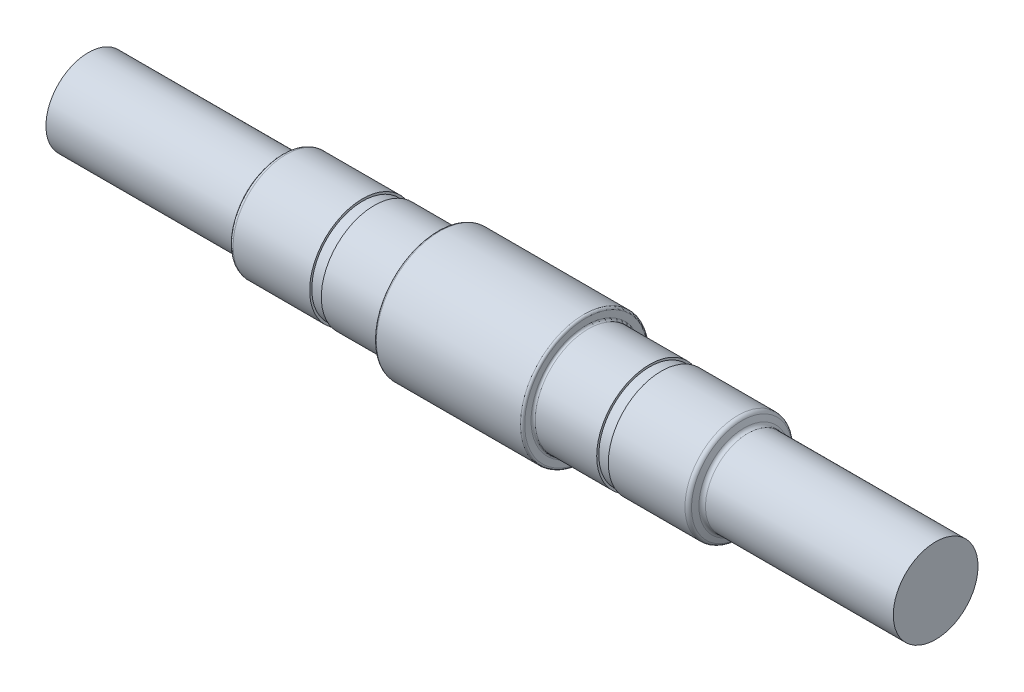
ISO-10303-21;
HEADER;
FILE_DESCRIPTION(('STEP AP214'),'2;1');
FILE_NAME('part.step','',(''),(''),'','','');
FILE_SCHEMA(('AUTOMOTIVE_DESIGN { 1 0 10303 214 1 1 1 1 }'));
ENDSEC;
DATA;
#1=APPLICATION_CONTEXT('core data for automotive mechanical design processes');
#2=APPLICATION_PROTOCOL_DEFINITION('international standard','automotive_design',2000,#1);
#3=PRODUCT_CONTEXT('',#1,'mechanical');
#4=PRODUCT('Part','Part','',(#3));
#5=PRODUCT_RELATED_PRODUCT_CATEGORY('part','',(#4));
#6=PRODUCT_DEFINITION_FORMATION('','',#4);
#7=PRODUCT_DEFINITION_CONTEXT('part definition',#1,'design');
#8=PRODUCT_DEFINITION('design','',#6,#7);
#9=PRODUCT_DEFINITION_SHAPE('','',#8);
#10=(LENGTH_UNIT() NAMED_UNIT(*) SI_UNIT(.MILLI.,.METRE.));
#11=(NAMED_UNIT(*) PLANE_ANGLE_UNIT() SI_UNIT($,.RADIAN.));
#12=(NAMED_UNIT(*) SI_UNIT($,.STERADIAN.) SOLID_ANGLE_UNIT());
#13=UNCERTAINTY_MEASURE_WITH_UNIT(LENGTH_MEASURE(1.E-05),#10,'distance_accuracy_value','');
#14=(GEOMETRIC_REPRESENTATION_CONTEXT(3) GLOBAL_UNCERTAINTY_ASSIGNED_CONTEXT((#13)) GLOBAL_UNIT_ASSIGNED_CONTEXT((#10,
#11,#12)) REPRESENTATION_CONTEXT('',''));
#15=CARTESIAN_POINT('',(0.,0.,0.));
#16=DIRECTION('',(0.,0.,1.));
#17=DIRECTION('',(1.,0.,0.));
#18=AXIS2_PLACEMENT_3D('',#15,#16,#17);
#19=CARTESIAN_POINT('',(-21.6,0.,0.));
#20=DIRECTION('',(1.,0.,0.));
#21=DIRECTION('',(0.,0.,-1.));
#22=AXIS2_PLACEMENT_3D('',#19,#20,#21);
#23=CYLINDRICAL_SURFACE('',#22,5.);
#24=CARTESIAN_POINT('',(-7.2,0.,0.));
#25=DIRECTION('',(-1.,0.,0.));
#26=DIRECTION('',(0.,0.,1.));
#27=AXIS2_PLACEMENT_3D('',#24,#25,#26);
#28=CIRCLE('',#27,5.);
#29=CARTESIAN_POINT('',(-7.2,0.,-5.));
#30=VERTEX_POINT('',#29);
#31=EDGE_CURVE('E65',#30,#30,#28,.T.);
#32=CARTESIAN_POINT('',(-13.,0.,0.));
#33=DIRECTION('',(-1.,0.,0.));
#34=DIRECTION('',(0.,0.,1.));
#35=AXIS2_PLACEMENT_3D('',#32,#33,#34);
#36=CIRCLE('',#35,5.);
#37=CARTESIAN_POINT('',(-13.,0.,-5.));
#38=VERTEX_POINT('',#37);
#39=EDGE_CURVE('E70',#38,#38,#36,.F.);
#40=CARTESIAN_POINT('',(-7.2,0.,-5.));
#41=CARTESIAN_POINT('',(-7.26041666666667,0.,-5.));
#42=CARTESIAN_POINT('',(-7.32083333333333,0.,-5.));
#43=CARTESIAN_POINT('',(-7.44166666666667,0.,-5.));
#44=CARTESIAN_POINT('',(-7.50208333333333,0.,-5.));
#45=CARTESIAN_POINT('',(-7.62291666666667,0.,-5.));
#46=CARTESIAN_POINT('',(-7.68333333333333,0.,-5.));
#47=CARTESIAN_POINT('',(-7.80416666666667,0.,-5.));
#48=CARTESIAN_POINT('',(-7.86458333333333,0.,-5.));
#49=CARTESIAN_POINT('',(-7.98541666666667,0.,-5.));
#50=CARTESIAN_POINT('',(-8.04583333333333,0.,-5.));
#51=CARTESIAN_POINT('',(-8.16666666666667,0.,-5.));
#52=CARTESIAN_POINT('',(-8.22708333333333,0.,-5.));
#53=CARTESIAN_POINT('',(-8.34791666666667,0.,-5.));
#54=CARTESIAN_POINT('',(-8.40833333333333,0.,-5.));
#55=CARTESIAN_POINT('',(-8.52916666666667,0.,-5.));
#56=CARTESIAN_POINT('',(-8.58958333333333,0.,-5.));
#57=CARTESIAN_POINT('',(-8.71041666666667,0.,-5.));
#58=CARTESIAN_POINT('',(-8.77083333333333,0.,-5.));
#59=CARTESIAN_POINT('',(-8.89166666666667,0.,-5.));
#60=CARTESIAN_POINT('',(-8.95208333333333,0.,-5.));
#61=CARTESIAN_POINT('',(-9.07291666666667,0.,-5.));
#62=CARTESIAN_POINT('',(-9.13333333333333,0.,-5.));
#63=CARTESIAN_POINT('',(-9.25416666666667,0.,-5.));
#64=CARTESIAN_POINT('',(-9.31458333333333,0.,-5.));
#65=CARTESIAN_POINT('',(-9.43541666666667,0.,-5.));
#66=CARTESIAN_POINT('',(-9.49583333333333,0.,-5.));
#67=CARTESIAN_POINT('',(-9.61666666666667,0.,-5.));
#68=CARTESIAN_POINT('',(-9.67708333333333,0.,-5.));
#69=CARTESIAN_POINT('',(-9.79791666666667,0.,-5.));
#70=CARTESIAN_POINT('',(-9.85833333333333,0.,-5.));
#71=CARTESIAN_POINT('',(-9.97916666666667,0.,-5.));
#72=CARTESIAN_POINT('',(-10.0395833333333,0.,-5.));
#73=CARTESIAN_POINT('',(-10.1604166666667,0.,-5.));
#74=CARTESIAN_POINT('',(-10.2208333333333,0.,-5.));
#75=CARTESIAN_POINT('',(-10.3416666666667,0.,-5.));
#76=CARTESIAN_POINT('',(-10.4020833333333,0.,-5.));
#77=CARTESIAN_POINT('',(-10.5229166666667,0.,-5.));
#78=CARTESIAN_POINT('',(-10.5833333333333,0.,-5.));
#79=CARTESIAN_POINT('',(-10.7041666666667,0.,-5.));
#80=CARTESIAN_POINT('',(-10.7645833333333,0.,-5.));
#81=CARTESIAN_POINT('',(-10.8854166666667,0.,-5.));
#82=CARTESIAN_POINT('',(-10.9458333333333,0.,-5.));
#83=CARTESIAN_POINT('',(-11.0666666666667,0.,-5.));
#84=CARTESIAN_POINT('',(-11.1270833333333,0.,-5.));
#85=CARTESIAN_POINT('',(-11.2479166666667,0.,-5.));
#86=CARTESIAN_POINT('',(-11.3083333333333,0.,-5.));
#87=CARTESIAN_POINT('',(-11.4291666666667,0.,-5.));
#88=CARTESIAN_POINT('',(-11.4895833333333,0.,-5.));
#89=CARTESIAN_POINT('',(-11.6104166666667,0.,-5.));
#90=CARTESIAN_POINT('',(-11.6708333333333,0.,-5.));
#91=CARTESIAN_POINT('',(-11.7916666666667,0.,-5.));
#92=CARTESIAN_POINT('',(-11.8520833333333,0.,-5.));
#93=CARTESIAN_POINT('',(-11.9729166666667,0.,-5.));
#94=CARTESIAN_POINT('',(-12.0333333333333,0.,-5.));
#95=CARTESIAN_POINT('',(-12.1541666666667,0.,-5.));
#96=CARTESIAN_POINT('',(-12.2145833333333,0.,-5.));
#97=CARTESIAN_POINT('',(-12.3354166666667,0.,-5.));
#98=CARTESIAN_POINT('',(-12.3958333333333,0.,-5.));
#99=CARTESIAN_POINT('',(-12.5166666666667,0.,-5.));
#100=CARTESIAN_POINT('',(-12.5770833333333,0.,-5.));
#101=CARTESIAN_POINT('',(-12.6979166666667,0.,-5.));
#102=CARTESIAN_POINT('',(-12.7583333333333,0.,-5.));
#103=CARTESIAN_POINT('',(-12.8791666666667,0.,-5.));
#104=CARTESIAN_POINT('',(-12.9395833333333,0.,-5.));
#105=CARTESIAN_POINT('',(-13.,0.,-5.));
#106=B_SPLINE_CURVE_WITH_KNOTS('',3,(#40,#41,#42,#43,#44,#45,#46,#47,#48,#49,#50,#51,#52,#53,
#54,#55,#56,#57,#58,#59,#60,#61,#62,#63,#64,#65,#66,#67,#68,#69,#70,#71,#72,#73,#74,#75,#76,#77,
#78,#79,#80,#81,#82,#83,#84,#85,#86,#87,#88,#89,#90,#91,#92,#93,#94,#95,#96,#97,#98,#99,#100,
#101,#102,#103,#104,#105),.UNSPECIFIED.,.F.,.F.,(4,2,2,2,2,2,2,2,2,2,2,2,2,2,2,2,2,2,2,2,2,2,2,
2,2,2,2,2,2,2,2,2,4),(0.,0.181250000000001,0.3625,0.543749999999999,0.725,0.906250000000001,
1.0875,1.26875,1.45,1.63125,1.8125,1.99375,2.175,2.35625,2.5375,2.71875,2.9,3.08125,3.2625,
3.44375,3.625,3.80625,3.9875,4.16875,4.35,4.53125,4.7125,4.89375,5.075,5.25625,5.4375,5.61875,
5.8),.UNSPECIFIED.);
#107=EDGE_CURVE('BSEAM45',#30,#38,#106,.T.);
#108=ORIENTED_EDGE('',*,*,#31,.T.);
#109=ORIENTED_EDGE('',*,*,#39,.T.);
#110=ORIENTED_EDGE('',*,*,#107,.T.);
#111=ORIENTED_EDGE('',*,*,#107,.F.);
#112=EDGE_LOOP('',(#108,#110,#109,#111));
#113=FACE_BOUND('',#112,.T.);
#114=ADVANCED_FACE('F45',(#113),#23,.T.);
#115=CARTESIAN_POINT('',(21.6,0.,0.));
#116=DIRECTION('',(-1.,0.,0.));
#117=DIRECTION('',(0.,0.,1.));
#118=AXIS2_PLACEMENT_3D('',#115,#116,#117);
#119=CYLINDRICAL_SURFACE('',#118,5.);
#120=CARTESIAN_POINT('',(7.2,0.,0.));
#121=DIRECTION('',(1.,0.,0.));
#122=DIRECTION('',(0.,0.,-1.));
#123=AXIS2_PLACEMENT_3D('',#120,#121,#122);
#124=CIRCLE('',#123,5.);
#125=CARTESIAN_POINT('',(7.2,0.,5.));
#126=VERTEX_POINT('',#125);
#127=EDGE_CURVE('E97',#126,#126,#124,.T.);
#128=CARTESIAN_POINT('',(13.,0.,0.));
#129=DIRECTION('',(1.,0.,0.));
#130=DIRECTION('',(0.,0.,-1.));
#131=AXIS2_PLACEMENT_3D('',#128,#129,#130);
#132=CIRCLE('',#131,5.);
#133=CARTESIAN_POINT('',(13.,0.,5.));
#134=VERTEX_POINT('',#133);
#135=EDGE_CURVE('E102',#134,#134,#132,.T.);
#136=CARTESIAN_POINT('',(7.2,0.,5.));
#137=CARTESIAN_POINT('',(7.26041666666667,0.,5.));
#138=CARTESIAN_POINT('',(7.32083333333333,0.,5.));
#139=CARTESIAN_POINT('',(7.44166666666667,0.,5.));
#140=CARTESIAN_POINT('',(7.50208333333333,0.,5.));
#141=CARTESIAN_POINT('',(7.62291666666667,0.,5.));
#142=CARTESIAN_POINT('',(7.68333333333333,0.,5.));
#143=CARTESIAN_POINT('',(7.80416666666667,0.,5.));
#144=CARTESIAN_POINT('',(7.86458333333333,0.,5.));
#145=CARTESIAN_POINT('',(7.98541666666667,0.,5.));
#146=CARTESIAN_POINT('',(8.04583333333333,0.,5.));
#147=CARTESIAN_POINT('',(8.16666666666667,0.,5.));
#148=CARTESIAN_POINT('',(8.22708333333333,0.,5.));
#149=CARTESIAN_POINT('',(8.34791666666667,0.,5.));
#150=CARTESIAN_POINT('',(8.40833333333333,0.,5.));
#151=CARTESIAN_POINT('',(8.52916666666667,0.,5.));
#152=CARTESIAN_POINT('',(8.58958333333333,0.,5.));
#153=CARTESIAN_POINT('',(8.71041666666667,0.,5.));
#154=CARTESIAN_POINT('',(8.77083333333333,0.,5.));
#155=CARTESIAN_POINT('',(8.89166666666667,0.,5.));
#156=CARTESIAN_POINT('',(8.95208333333333,0.,5.));
#157=CARTESIAN_POINT('',(9.07291666666667,0.,5.));
#158=CARTESIAN_POINT('',(9.13333333333333,0.,5.));
#159=CARTESIAN_POINT('',(9.25416666666667,0.,5.));
#160=CARTESIAN_POINT('',(9.31458333333333,0.,5.));
#161=CARTESIAN_POINT('',(9.43541666666667,0.,5.));
#162=CARTESIAN_POINT('',(9.49583333333333,0.,5.));
#163=CARTESIAN_POINT('',(9.61666666666667,0.,5.));
#164=CARTESIAN_POINT('',(9.67708333333333,0.,5.));
#165=CARTESIAN_POINT('',(9.79791666666667,0.,5.));
#166=CARTESIAN_POINT('',(9.85833333333333,0.,5.));
#167=CARTESIAN_POINT('',(9.97916666666667,0.,5.));
#168=CARTESIAN_POINT('',(10.0395833333333,0.,5.));
#169=CARTESIAN_POINT('',(10.1604166666667,0.,5.));
#170=CARTESIAN_POINT('',(10.2208333333333,0.,5.));
#171=CARTESIAN_POINT('',(10.3416666666667,0.,5.));
#172=CARTESIAN_POINT('',(10.4020833333333,0.,5.));
#173=CARTESIAN_POINT('',(10.5229166666667,0.,5.));
#174=CARTESIAN_POINT('',(10.5833333333333,0.,5.));
#175=CARTESIAN_POINT('',(10.7041666666667,0.,5.));
#176=CARTESIAN_POINT('',(10.7645833333333,0.,5.));
#177=CARTESIAN_POINT('',(10.8854166666667,0.,5.));
#178=CARTESIAN_POINT('',(10.9458333333333,0.,5.));
#179=CARTESIAN_POINT('',(11.0666666666667,0.,5.));
#180=CARTESIAN_POINT('',(11.1270833333333,0.,5.));
#181=CARTESIAN_POINT('',(11.2479166666667,0.,5.));
#182=CARTESIAN_POINT('',(11.3083333333333,0.,5.));
#183=CARTESIAN_POINT('',(11.4291666666667,0.,5.));
#184=CARTESIAN_POINT('',(11.4895833333333,0.,5.));
#185=CARTESIAN_POINT('',(11.6104166666667,0.,5.));
#186=CARTESIAN_POINT('',(11.6708333333333,0.,5.));
#187=CARTESIAN_POINT('',(11.7916666666667,0.,5.));
#188=CARTESIAN_POINT('',(11.8520833333333,0.,5.));
#189=CARTESIAN_POINT('',(11.9729166666667,0.,5.));
#190=CARTESIAN_POINT('',(12.0333333333333,0.,5.));
#191=CARTESIAN_POINT('',(12.1541666666667,0.,5.));
#192=CARTESIAN_POINT('',(12.2145833333333,0.,5.));
#193=CARTESIAN_POINT('',(12.3354166666667,0.,5.));
#194=CARTESIAN_POINT('',(12.3958333333333,0.,5.));
#195=CARTESIAN_POINT('',(12.5166666666667,0.,5.));
#196=CARTESIAN_POINT('',(12.5770833333333,0.,5.));
#197=CARTESIAN_POINT('',(12.6979166666667,0.,5.));
#198=CARTESIAN_POINT('',(12.7583333333333,0.,5.));
#199=CARTESIAN_POINT('',(12.8791666666667,0.,5.));
#200=CARTESIAN_POINT('',(12.9395833333333,0.,5.));
#201=CARTESIAN_POINT('',(13.,0.,5.));
#202=B_SPLINE_CURVE_WITH_KNOTS('',3,(#136,#137,#138,#139,#140,#141,#142,#143,#144,#145,#146,
#147,#148,#149,#150,#151,#152,#153,#154,#155,#156,#157,#158,#159,#160,#161,#162,#163,#164,#165,
#166,#167,#168,#169,#170,#171,#172,#173,#174,#175,#176,#177,#178,#179,#180,#181,#182,#183,#184,
#185,#186,#187,#188,#189,#190,#191,#192,#193,#194,#195,#196,#197,#198,#199,#200,#201),
.UNSPECIFIED.,.F.,.F.,(4,2,2,2,2,2,2,2,2,2,2,2,2,2,2,2,2,2,2,2,2,2,2,2,2,2,2,2,2,2,2,2,4),(0.,
0.181250000000001,0.3625,0.543749999999999,0.725,0.906250000000001,1.0875,1.26875,1.45,1.63125,
1.8125,1.99375,2.175,2.35625,2.5375,2.71875,2.9,3.08125,3.2625,3.44375,3.625,3.80625,3.9875,
4.16875,4.35,4.53125,4.7125,4.89375,5.075,5.25625,5.4375,5.61875,5.8),.UNSPECIFIED.);
#203=EDGE_CURVE('BSEAM154',#126,#134,#202,.T.);
#204=ORIENTED_EDGE('',*,*,#127,.T.);
#205=ORIENTED_EDGE('',*,*,#135,.F.);
#206=ORIENTED_EDGE('',*,*,#203,.T.);
#207=ORIENTED_EDGE('',*,*,#203,.F.);
#208=EDGE_LOOP('',(#204,#206,#205,#207));
#209=FACE_BOUND('',#208,.T.);
#210=ADVANCED_FACE('F154',(#209),#119,.T.);
#211=CARTESIAN_POINT('',(7.,0.,0.));
#212=DIRECTION('',(-1.,0.,0.));
#213=DIRECTION('',(0.,0.,1.));
#214=AXIS2_PLACEMENT_3D('',#211,#212,#213);
#215=CYLINDRICAL_SURFACE('',#214,6.);
#216=CARTESIAN_POINT('',(-6.8,0.,0.));
#217=DIRECTION('',(-1.,0.,0.));
#218=DIRECTION('',(0.,0.,1.));
#219=AXIS2_PLACEMENT_3D('',#216,#217,#218);
#220=CIRCLE('',#219,6.);
#221=CARTESIAN_POINT('',(-6.8,0.,6.));
#222=VERTEX_POINT('',#221);
#223=EDGE_CURVE('E82',#222,#222,#220,.F.);
#224=ORIENTED_EDGE('',*,*,#223,.T.);
#225=EDGE_LOOP('',(#224));
#226=FACE_BOUND('',#225,.T.);
#227=CARTESIAN_POINT('',(6.8,0.,0.));
#228=DIRECTION('',(1.,0.,0.));
#229=DIRECTION('',(0.,0.,-1.));
#230=AXIS2_PLACEMENT_3D('',#227,#228,#229);
#231=CIRCLE('',#230,6.);
#232=CARTESIAN_POINT('',(6.8,0.,-6.));
#233=VERTEX_POINT('',#232);
#234=EDGE_CURVE('E108',#233,#233,#231,.F.);
#235=ORIENTED_EDGE('',*,*,#234,.T.);
#236=EDGE_LOOP('',(#235));
#237=FACE_BOUND('',#236,.T.);
#238=ADVANCED_FACE('F163',(#226,#237),#215,.T.);
#239=CARTESIAN_POINT('',(7.,0.,0.));
#240=DIRECTION('',(1.,0.,0.));
#241=DIRECTION('',(0.,0.,-1.));
#242=AXIS2_PLACEMENT_3D('',#239,#240,#241);
#243=PLANE('',#242);
#244=CARTESIAN_POINT('',(7.,0.,0.));
#245=DIRECTION('',(1.,0.,0.));
#246=DIRECTION('',(0.,0.,-1.));
#247=AXIS2_PLACEMENT_3D('',#244,#245,#246);
#248=CIRCLE('',#247,5.8);
#249=CARTESIAN_POINT('',(7.,0.,-5.8));
#250=VERTEX_POINT('',#249);
#251=EDGE_CURVE('E111',#250,#250,#248,.T.);
#252=ORIENTED_EDGE('',*,*,#251,.T.);
#253=EDGE_LOOP('',(#252));
#254=FACE_BOUND('',#253,.T.);
#255=CARTESIAN_POINT('',(7.,0.,0.));
#256=DIRECTION('',(1.,0.,0.));
#257=DIRECTION('',(0.,0.,-1.));
#258=AXIS2_PLACEMENT_3D('',#255,#256,#257);
#259=CIRCLE('',#258,5.2);
#260=CARTESIAN_POINT('',(7.,0.,-5.2));
#261=VERTEX_POINT('',#260);
#262=EDGE_CURVE('E114',#261,#261,#259,.F.);
#263=ORIENTED_EDGE('',*,*,#262,.T.);
#264=EDGE_LOOP('',(#263));
#265=FACE_BOUND('',#264,.T.);
#266=ADVANCED_FACE('F257',(#254,#265),#243,.T.);
#267=CARTESIAN_POINT('',(6.8,0.,0.));
#268=DIRECTION('',(1.,0.,0.));
#269=DIRECTION('',(0.,0.,-1.));
#270=AXIS2_PLACEMENT_3D('',#267,#268,#269);
#271=TOROIDAL_SURFACE('',#270,5.8,0.2);
#272=ORIENTED_EDGE('',*,*,#234,.F.);
#273=EDGE_LOOP('',(#272));
#274=FACE_BOUND('',#273,.T.);
#275=ORIENTED_EDGE('',*,*,#251,.F.);
#276=EDGE_LOOP('',(#275));
#277=FACE_BOUND('',#276,.T.);
#278=ADVANCED_FACE('F323',(#274,#277),#271,.T.);
#279=CARTESIAN_POINT('',(7.2,0.,0.));
#280=DIRECTION('',(1.,0.,0.));
#281=DIRECTION('',(0.,0.,-1.));
#282=AXIS2_PLACEMENT_3D('',#279,#280,#281);
#283=TOROIDAL_SURFACE('',#282,5.2,0.2);
#284=ORIENTED_EDGE('',*,*,#127,.F.);
#285=EDGE_LOOP('',(#284));
#286=FACE_BOUND('',#285,.T.);
#287=ORIENTED_EDGE('',*,*,#262,.F.);
#288=EDGE_LOOP('',(#287));
#289=FACE_BOUND('',#288,.T.);
#290=ADVANCED_FACE('F311',(#286,#289),#283,.F.);
#291=CARTESIAN_POINT('',(14.1,0.,0.));
#292=DIRECTION('',(1.,0.,0.));
#293=DIRECTION('',(0.,0.,-1.));
#294=AXIS2_PLACEMENT_3D('',#291,#292,#293);
#295=PLANE('',#294);
#296=CARTESIAN_POINT('',(14.1,0.,0.));
#297=DIRECTION('',(1.,0.,0.));
#298=DIRECTION('',(0.,0.,-1.));
#299=AXIS2_PLACEMENT_3D('',#296,#297,#298);
#300=CIRCLE('',#299,4.8);
#301=CARTESIAN_POINT('',(14.1,0.,-4.8));
#302=VERTEX_POINT('',#301);
#303=EDGE_CURVE('E105',#302,#302,#300,.T.);
#304=ORIENTED_EDGE('',*,*,#303,.T.);
#305=EDGE_LOOP('',(#304));
#306=FACE_BOUND('',#305,.T.);
#307=CARTESIAN_POINT('',(14.1,0.,0.));
#308=DIRECTION('',(1.,0.,0.));
#309=DIRECTION('',(0.,0.,-1.));
#310=AXIS2_PLACEMENT_3D('',#307,#308,#309);
#311=CIRCLE('',#310,5.);
#312=CARTESIAN_POINT('',(14.1,0.,5.));
#313=VERTEX_POINT('',#312);
#314=EDGE_CURVE('E98',#313,#313,#311,.T.);
#315=ORIENTED_EDGE('',*,*,#314,.F.);
#316=EDGE_LOOP('',(#315));
#317=FACE_BOUND('',#316,.T.);
#318=ADVANCED_FACE('F303',(#306,#317),#295,.F.);
#319=CARTESIAN_POINT('',(13.,0.,0.));
#320=DIRECTION('',(1.,0.,0.));
#321=DIRECTION('',(0.,0.,-1.));
#322=AXIS2_PLACEMENT_3D('',#319,#320,#321);
#323=PLANE('',#322);
#324=CARTESIAN_POINT('',(13.,0.,0.));
#325=DIRECTION('',(1.,0.,0.));
#326=DIRECTION('',(0.,0.,-1.));
#327=AXIS2_PLACEMENT_3D('',#324,#325,#326);
#328=CIRCLE('',#327,4.8);
#329=CARTESIAN_POINT('',(13.,0.,-4.8));
#330=VERTEX_POINT('',#329);
#331=EDGE_CURVE('E119',#330,#330,#328,.T.);
#332=ORIENTED_EDGE('',*,*,#331,.F.);
#333=EDGE_LOOP('',(#332));
#334=FACE_BOUND('',#333,.T.);
#335=ORIENTED_EDGE('',*,*,#135,.T.);
#336=EDGE_LOOP('',(#335));
#337=FACE_BOUND('',#336,.T.);
#338=ADVANCED_FACE('F295',(#334,#337),#323,.T.);
#339=CARTESIAN_POINT('',(14.1,0.,0.));
#340=DIRECTION('',(-1.,0.,0.));
#341=DIRECTION('',(0.,0.,1.));
#342=AXIS2_PLACEMENT_3D('',#339,#340,#341);
#343=CYLINDRICAL_SURFACE('',#342,4.8);
#344=ORIENTED_EDGE('',*,*,#303,.F.);
#345=EDGE_LOOP('',(#344));
#346=FACE_BOUND('',#345,.T.);
#347=ORIENTED_EDGE('',*,*,#331,.T.);
#348=EDGE_LOOP('',(#347));
#349=FACE_BOUND('',#348,.T.);
#350=ADVANCED_FACE('F290',(#346,#349),#343,.T.);
#351=CARTESIAN_POINT('',(21.330196593263,0.,0.));
#352=DIRECTION('',(-1.,0.,0.));
#353=DIRECTION('',(0.,0.,1.));
#354=AXIS2_PLACEMENT_3D('',#351,#352,#353);
#355=CIRCLE('',#354,5.);
#356=CARTESIAN_POINT('',(21.330196593263,0.,5.));
#357=VERTEX_POINT('',#356);
#358=EDGE_CURVE('E85',#357,#357,#355,.T.);
#359=CARTESIAN_POINT('',(21.330196593263,0.,5.));
#360=CARTESIAN_POINT('',(21.2548820454165,0.,5.));
#361=CARTESIAN_POINT('',(21.1795674975701,0.,5.));
#362=CARTESIAN_POINT('',(21.0289384018771,0.,5.));
#363=CARTESIAN_POINT('',(20.9536238540306,0.,5.));
#364=CARTESIAN_POINT('',(20.8029947583376,0.,5.));
#365=CARTESIAN_POINT('',(20.7276802104911,0.,5.));
#366=CARTESIAN_POINT('',(20.5770511147981,0.,5.));
#367=CARTESIAN_POINT('',(20.5017365669516,0.,5.));
#368=CARTESIAN_POINT('',(20.3511074712587,0.,5.));
#369=CARTESIAN_POINT('',(20.2757929234122,0.,5.));
#370=CARTESIAN_POINT('',(20.1251638277192,0.,5.));
#371=CARTESIAN_POINT('',(20.0498492798727,0.,5.));
#372=CARTESIAN_POINT('',(19.8992201841797,0.,5.));
#373=CARTESIAN_POINT('',(19.8239056363332,0.,5.));
#374=CARTESIAN_POINT('',(19.6732765406403,0.,5.));
#375=CARTESIAN_POINT('',(19.5979619927938,0.,5.));
#376=CARTESIAN_POINT('',(19.4473328971008,0.,5.));
#377=CARTESIAN_POINT('',(19.3720183492543,0.,5.));
#378=CARTESIAN_POINT('',(19.2213892535613,0.,5.));
#379=CARTESIAN_POINT('',(19.1460747057148,0.,5.));
#380=CARTESIAN_POINT('',(18.9954456100219,0.,5.));
#381=CARTESIAN_POINT('',(18.9201310621754,0.,5.));
#382=CARTESIAN_POINT('',(18.7695019664824,0.,5.));
#383=CARTESIAN_POINT('',(18.6941874186359,0.,5.));
#384=CARTESIAN_POINT('',(18.5435583229429,0.,5.));
#385=CARTESIAN_POINT('',(18.4682437750964,0.,5.));
#386=CARTESIAN_POINT('',(18.3176146794034,0.,5.));
#387=CARTESIAN_POINT('',(18.2423001315569,0.,5.));
#388=CARTESIAN_POINT('',(18.091671035864,0.,5.));
#389=CARTESIAN_POINT('',(18.0163564880175,0.,5.));
#390=CARTESIAN_POINT('',(17.8657273923245,0.,5.));
#391=CARTESIAN_POINT('',(17.790412844478,0.,5.));
#392=CARTESIAN_POINT('',(17.639783748785,0.,5.));
#393=CARTESIAN_POINT('',(17.5644692009385,0.,5.));
#394=CARTESIAN_POINT('',(17.4138401052456,0.,5.));
#395=CARTESIAN_POINT('',(17.3385255573991,0.,5.));
#396=CARTESIAN_POINT('',(17.1878964617061,0.,5.));
#397=CARTESIAN_POINT('',(17.1125819138596,0.,5.));
#398=CARTESIAN_POINT('',(16.9619528181666,0.,5.));
#399=CARTESIAN_POINT('',(16.8866382703201,0.,5.));
#400=CARTESIAN_POINT('',(16.7360091746271,0.,5.));
#401=CARTESIAN_POINT('',(16.6606946267807,0.,5.));
#402=CARTESIAN_POINT('',(16.5100655310877,0.,5.));
#403=CARTESIAN_POINT('',(16.4347509832412,0.,5.));
#404=CARTESIAN_POINT('',(16.2841218875482,0.,5.));
#405=CARTESIAN_POINT('',(16.2088073397017,0.,5.));
#406=CARTESIAN_POINT('',(16.0581782440087,0.,5.));
#407=CARTESIAN_POINT('',(15.9828636961622,0.,5.));
#408=CARTESIAN_POINT('',(15.8322346004693,0.,5.));
#409=CARTESIAN_POINT('',(15.7569200526228,0.,5.));
#410=CARTESIAN_POINT('',(15.6062909569298,0.,5.));
#411=CARTESIAN_POINT('',(15.5309764090833,0.,5.));
#412=CARTESIAN_POINT('',(15.3803473133903,0.,5.));
#413=CARTESIAN_POINT('',(15.3050327655438,0.,5.));
#414=CARTESIAN_POINT('',(15.1544036698509,0.,5.));
#415=CARTESIAN_POINT('',(15.0790891220044,0.,5.));
#416=CARTESIAN_POINT('',(14.9284600263114,0.,5.));
#417=CARTESIAN_POINT('',(14.8531454784649,0.,5.));
#418=CARTESIAN_POINT('',(14.7025163827719,0.,5.));
#419=CARTESIAN_POINT('',(14.6272018349254,0.,5.));
#420=CARTESIAN_POINT('',(14.4765727392325,0.,5.));
#421=CARTESIAN_POINT('',(14.401258191386,0.,5.));
#422=CARTESIAN_POINT('',(14.250629095693,0.,5.));
#423=CARTESIAN_POINT('',(14.1753145478465,0.,5.));
#424=CARTESIAN_POINT('',(14.1,0.,5.));
#425=B_SPLINE_CURVE_WITH_KNOTS('',3,(#359,#360,#361,#362,#363,#364,#365,#366,#367,#368,#369,
#370,#371,#372,#373,#374,#375,#376,#377,#378,#379,#380,#381,#382,#383,#384,#385,#386,#387,#388,
#389,#390,#391,#392,#393,#394,#395,#396,#397,#398,#399,#400,#401,#402,#403,#404,#405,#406,#407,
#408,#409,#410,#411,#412,#413,#414,#415,#416,#417,#418,#419,#420,#421,#422,#423,#424),
.UNSPECIFIED.,.F.,.F.,(4,2,2,2,2,2,2,2,2,2,2,2,2,2,2,2,2,2,2,2,2,2,2,2,2,2,2,2,2,2,2,2,4),(0.,
0.225943643539468,0.451887287078939,0.677830930618409,0.903774574157877,1.12971821769735,
1.35566186123682,1.58160550477629,1.80754914831576,2.03349279185523,2.2594364353947,
2.48538007893417,2.71132372247364,2.93726736601311,3.16321100955258,3.38915465309205,
3.61509829663152,3.84104194017099,4.06698558371046,4.29292922724992,4.5188728707894,
4.74481651432887,4.97076015786833,5.19670380140781,5.42264744494728,5.64859108848674,
5.87453473202621,6.10047837556569,6.32642201910515,6.55236566264462,6.7783093061841,
7.00425294972356,7.23019659326303),.UNSPECIFIED.);
#426=EDGE_CURVE('BSEAM166',#357,#313,#425,.T.);
#427=ORIENTED_EDGE('',*,*,#358,.T.);
#428=ORIENTED_EDGE('',*,*,#314,.T.);
#429=ORIENTED_EDGE('',*,*,#426,.T.);
#430=ORIENTED_EDGE('',*,*,#426,.F.);
#431=EDGE_LOOP('',(#427,#429,#428,#430));
#432=FACE_BOUND('',#431,.T.);
#433=ADVANCED_FACE('F166',(#432),#119,.T.);
#434=CARTESIAN_POINT('',(22.0040262258352,0.,0.));
#435=DIRECTION('',(-1.,0.,0.));
#436=DIRECTION('',(0.,0.,1.));
#437=AXIS2_PLACEMENT_3D('',#434,#435,#436);
#438=CONICAL_SURFACE('',#437,4.,1.18682389135614);
#439=CARTESIAN_POINT('',(21.9029560907454,0.,0.));
#440=DIRECTION('',(1.,0.,0.));
#441=DIRECTION('',(0.,0.,-1.));
#442=AXIS2_PLACEMENT_3D('',#439,#440,#441);
#443=CIRCLE('',#442,4.25015736263363);
#444=CARTESIAN_POINT('',(21.9029560907454,0.,-4.25015736263363));
#445=VERTEX_POINT('',#444);
#446=EDGE_CURVE('E88',#445,#445,#443,.F.);
#447=ORIENTED_EDGE('',*,*,#446,.T.);
#448=EDGE_LOOP('',(#447));
#449=FACE_BOUND('',#448,.T.);
#450=CARTESIAN_POINT('',(21.7010701350897,0.,0.));
#451=DIRECTION('',(-1.,0.,0.));
#452=DIRECTION('',(0.,0.,1.));
#453=AXIS2_PLACEMENT_3D('',#450,#451,#452);
#454=CIRCLE('',#453,4.74984263736637);
#455=CARTESIAN_POINT('',(21.7010701350897,0.,4.74984263736637));
#456=VERTEX_POINT('',#455);
#457=EDGE_CURVE('E91',#456,#456,#454,.F.);
#458=ORIENTED_EDGE('',*,*,#457,.T.);
#459=EDGE_LOOP('',(#458));
#460=FACE_BOUND('',#459,.T.);
#461=ADVANCED_FACE('F282',(#449,#460),#438,.T.);
#462=CARTESIAN_POINT('',(40.,0.,0.));
#463=DIRECTION('',(1.,0.,0.));
#464=DIRECTION('',(0.,0.,-1.));
#465=AXIS2_PLACEMENT_3D('',#462,#463,#464);
#466=PLANE('',#465);
#467=CARTESIAN_POINT('',(40.,0.,0.));
#468=DIRECTION('',(1.,0.,0.));
#469=DIRECTION('',(0.,0.,-1.));
#470=AXIS2_PLACEMENT_3D('',#467,#468,#469);
#471=CIRCLE('',#470,4.);
#472=CARTESIAN_POINT('',(40.,0.,-4.));
#473=VERTEX_POINT('',#472);
#474=EDGE_CURVE('E101',#473,#473,#471,.T.);
#475=ORIENTED_EDGE('',*,*,#474,.T.);
#476=EDGE_LOOP('',(#475));
#477=FACE_BOUND('',#476,.T.);
#478=ADVANCED_FACE('F204',(#477),#466,.T.);
#479=CARTESIAN_POINT('',(40.,0.,0.));
#480=DIRECTION('',(-1.,0.,0.));
#481=DIRECTION('',(0.,0.,1.));
#482=AXIS2_PLACEMENT_3D('',#479,#480,#481);
#483=CYLINDRICAL_SURFACE('',#482,4.);
#484=CARTESIAN_POINT('',(22.2738296325721,0.,0.));
#485=DIRECTION('',(1.,0.,0.));
#486=DIRECTION('',(0.,0.,-1.));
#487=AXIS2_PLACEMENT_3D('',#484,#485,#486);
#488=CIRCLE('',#487,4.);
#489=CARTESIAN_POINT('',(22.2738296325721,0.,-4.));
#490=VERTEX_POINT('',#489);
#491=EDGE_CURVE('E94',#490,#490,#488,.T.);
#492=ORIENTED_EDGE('',*,*,#491,.T.);
#493=EDGE_LOOP('',(#492));
#494=FACE_BOUND('',#493,.T.);
#495=ORIENTED_EDGE('',*,*,#474,.F.);
#496=EDGE_LOOP('',(#495));
#497=FACE_BOUND('',#496,.T.);
#498=ADVANCED_FACE('F199',(#494,#497),#483,.T.);
#499=CARTESIAN_POINT('',(22.2738296325721,0.,0.));
#500=DIRECTION('',(1.,0.,0.));
#501=DIRECTION('',(0.,0.,-1.));
#502=AXIS2_PLACEMENT_3D('',#499,#500,#501);
#503=TOROIDAL_SURFACE('',#502,4.4,0.4);
#504=ORIENTED_EDGE('',*,*,#446,.F.);
#505=EDGE_LOOP('',(#504));
#506=FACE_BOUND('',#505,.T.);
#507=ORIENTED_EDGE('',*,*,#491,.F.);
#508=EDGE_LOOP('',(#507));
#509=FACE_BOUND('',#508,.T.);
#510=ADVANCED_FACE('F203',(#506,#509),#503,.F.);
#511=CARTESIAN_POINT('',(21.330196593263,0.,0.));
#512=DIRECTION('',(-1.,0.,0.));
#513=DIRECTION('',(0.,0.,1.));
#514=AXIS2_PLACEMENT_3D('',#511,#512,#513);
#515=TOROIDAL_SURFACE('',#514,4.6,0.4);
#516=ORIENTED_EDGE('',*,*,#358,.F.);
#517=EDGE_LOOP('',(#516));
#518=FACE_BOUND('',#517,.T.);
#519=ORIENTED_EDGE('',*,*,#457,.F.);
#520=EDGE_LOOP('',(#519));
#521=FACE_BOUND('',#520,.T.);
#522=ADVANCED_FACE('F247',(#518,#521),#515,.T.);
#523=CARTESIAN_POINT('',(-7.,0.,0.));
#524=DIRECTION('',(-1.,0.,0.));
#525=DIRECTION('',(0.,0.,-1.));
#526=AXIS2_PLACEMENT_3D('',#523,#524,#525);
#527=PLANE('',#526);
#528=CARTESIAN_POINT('',(-7.,0.,0.));
#529=DIRECTION('',(-1.,0.,0.));
#530=DIRECTION('',(0.,0.,1.));
#531=AXIS2_PLACEMENT_3D('',#528,#529,#530);
#532=CIRCLE('',#531,5.8);
#533=CARTESIAN_POINT('',(-7.,0.,5.8));
#534=VERTEX_POINT('',#533);
#535=EDGE_CURVE('E76',#534,#534,#532,.T.);
#536=ORIENTED_EDGE('',*,*,#535,.T.);
#537=EDGE_LOOP('',(#536));
#538=FACE_BOUND('',#537,.T.);
#539=CARTESIAN_POINT('',(-7.,0.,0.));
#540=DIRECTION('',(-1.,0.,0.));
#541=DIRECTION('',(0.,0.,1.));
#542=AXIS2_PLACEMENT_3D('',#539,#540,#541);
#543=CIRCLE('',#542,5.2);
#544=CARTESIAN_POINT('',(-7.,0.,5.2));
#545=VERTEX_POINT('',#544);
#546=EDGE_CURVE('E79',#545,#545,#543,.F.);
#547=ORIENTED_EDGE('',*,*,#546,.T.);
#548=EDGE_LOOP('',(#547));
#549=FACE_BOUND('',#548,.T.);
#550=ADVANCED_FACE('F233',(#538,#549),#527,.T.);
#551=CARTESIAN_POINT('',(-6.8,0.,0.));
#552=DIRECTION('',(-1.,0.,0.));
#553=DIRECTION('',(0.,0.,1.));
#554=AXIS2_PLACEMENT_3D('',#551,#552,#553);
#555=TOROIDAL_SURFACE('',#554,5.8,0.2);
#556=ORIENTED_EDGE('',*,*,#535,.F.);
#557=EDGE_LOOP('',(#556));
#558=FACE_BOUND('',#557,.T.);
#559=ORIENTED_EDGE('',*,*,#223,.F.);
#560=EDGE_LOOP('',(#559));
#561=FACE_BOUND('',#560,.T.);
#562=ADVANCED_FACE('F149',(#558,#561),#555,.T.);
#563=CARTESIAN_POINT('',(-7.2,0.,0.));
#564=DIRECTION('',(-1.,0.,0.));
#565=DIRECTION('',(0.,0.,1.));
#566=AXIS2_PLACEMENT_3D('',#563,#564,#565);
#567=TOROIDAL_SURFACE('',#566,5.2,0.2);
#568=ORIENTED_EDGE('',*,*,#546,.F.);
#569=EDGE_LOOP('',(#568));
#570=FACE_BOUND('',#569,.T.);
#571=ORIENTED_EDGE('',*,*,#31,.F.);
#572=EDGE_LOOP('',(#571));
#573=FACE_BOUND('',#572,.T.);
#574=ADVANCED_FACE('F138',(#570,#573),#567,.F.);
#575=CARTESIAN_POINT('',(-14.1,0.,0.));
#576=DIRECTION('',(-1.,0.,0.));
#577=DIRECTION('',(0.,0.,-1.));
#578=AXIS2_PLACEMENT_3D('',#575,#576,#577);
#579=PLANE('',#578);
#580=CARTESIAN_POINT('',(-14.1,0.,0.));
#581=DIRECTION('',(-1.,0.,0.));
#582=DIRECTION('',(0.,0.,1.));
#583=AXIS2_PLACEMENT_3D('',#580,#581,#582);
#584=CIRCLE('',#583,5.);
#585=CARTESIAN_POINT('',(-14.1,0.,-5.));
#586=VERTEX_POINT('',#585);
#587=EDGE_CURVE('E66',#586,#586,#584,.F.);
#588=ORIENTED_EDGE('',*,*,#587,.T.);
#589=EDGE_LOOP('',(#588));
#590=FACE_BOUND('',#589,.T.);
#591=CARTESIAN_POINT('',(-14.1,0.,0.));
#592=DIRECTION('',(1.,0.,0.));
#593=DIRECTION('',(0.,0.,-1.));
#594=AXIS2_PLACEMENT_3D('',#591,#592,#593);
#595=CIRCLE('',#594,4.8);
#596=CARTESIAN_POINT('',(-14.1,0.,-4.8));
#597=VERTEX_POINT('',#596);
#598=EDGE_CURVE('E73',#597,#597,#595,.T.);
#599=ORIENTED_EDGE('',*,*,#598,.F.);
#600=EDGE_LOOP('',(#599));
#601=FACE_BOUND('',#600,.T.);
#602=ADVANCED_FACE('F135',(#590,#601),#579,.F.);
#603=CARTESIAN_POINT('',(-13.,0.,0.));
#604=DIRECTION('',(-1.,0.,0.));
#605=DIRECTION('',(0.,0.,-1.));
#606=AXIS2_PLACEMENT_3D('',#603,#604,#605);
#607=PLANE('',#606);
#608=ORIENTED_EDGE('',*,*,#39,.F.);
#609=EDGE_LOOP('',(#608));
#610=FACE_BOUND('',#609,.T.);
#611=CARTESIAN_POINT('',(-13.,0.,0.));
#612=DIRECTION('',(1.,0.,0.));
#613=DIRECTION('',(0.,0.,-1.));
#614=AXIS2_PLACEMENT_3D('',#611,#612,#613);
#615=CIRCLE('',#614,4.8);
#616=CARTESIAN_POINT('',(-13.,0.,-4.8));
#617=VERTEX_POINT('',#616);
#618=EDGE_CURVE('E126',#617,#617,#615,.T.);
#619=ORIENTED_EDGE('',*,*,#618,.T.);
#620=EDGE_LOOP('',(#619));
#621=FACE_BOUND('',#620,.T.);
#622=ADVANCED_FACE('F137',(#610,#621),#607,.T.);
#623=CARTESIAN_POINT('',(-14.1,0.,0.));
#624=DIRECTION('',(1.,0.,0.));
#625=DIRECTION('',(0.,0.,-1.));
#626=AXIS2_PLACEMENT_3D('',#623,#624,#625);
#627=CYLINDRICAL_SURFACE('',#626,4.8);
#628=ORIENTED_EDGE('',*,*,#598,.T.);
#629=EDGE_LOOP('',(#628));
#630=FACE_BOUND('',#629,.T.);
#631=ORIENTED_EDGE('',*,*,#618,.F.);
#632=EDGE_LOOP('',(#631));
#633=FACE_BOUND('',#632,.T.);
#634=ADVANCED_FACE('F132',(#630,#633),#627,.T.);
#635=CARTESIAN_POINT('',(-21.330196593263,0.,0.));
#636=DIRECTION('',(-1.,0.,0.));
#637=DIRECTION('',(0.,0.,1.));
#638=AXIS2_PLACEMENT_3D('',#635,#636,#637);
#639=CIRCLE('',#638,5.);
#640=CARTESIAN_POINT('',(-21.330196593263,0.,-5.));
#641=VERTEX_POINT('',#640);
#642=EDGE_CURVE('E10',#641,#641,#639,.F.);
#643=CARTESIAN_POINT('',(-21.330196593263,0.,-5.));
#644=CARTESIAN_POINT('',(-21.2548820454165,0.,-5.));
#645=CARTESIAN_POINT('',(-21.1795674975701,0.,-5.));
#646=CARTESIAN_POINT('',(-21.0289384018771,0.,-5.));
#647=CARTESIAN_POINT('',(-20.9536238540306,0.,-5.));
#648=CARTESIAN_POINT('',(-20.8029947583376,0.,-5.));
#649=CARTESIAN_POINT('',(-20.7276802104911,0.,-5.));
#650=CARTESIAN_POINT('',(-20.5770511147981,0.,-5.));
#651=CARTESIAN_POINT('',(-20.5017365669516,0.,-5.));
#652=CARTESIAN_POINT('',(-20.3511074712587,0.,-5.));
#653=CARTESIAN_POINT('',(-20.2757929234122,0.,-5.));
#654=CARTESIAN_POINT('',(-20.1251638277192,0.,-5.));
#655=CARTESIAN_POINT('',(-20.0498492798727,0.,-5.));
#656=CARTESIAN_POINT('',(-19.8992201841797,0.,-5.));
#657=CARTESIAN_POINT('',(-19.8239056363332,0.,-5.));
#658=CARTESIAN_POINT('',(-19.6732765406403,0.,-5.));
#659=CARTESIAN_POINT('',(-19.5979619927938,0.,-5.));
#660=CARTESIAN_POINT('',(-19.4473328971008,0.,-5.));
#661=CARTESIAN_POINT('',(-19.3720183492543,0.,-5.));
#662=CARTESIAN_POINT('',(-19.2213892535613,0.,-5.));
#663=CARTESIAN_POINT('',(-19.1460747057148,0.,-5.));
#664=CARTESIAN_POINT('',(-18.9954456100218,0.,-5.));
#665=CARTESIAN_POINT('',(-18.9201310621754,0.,-5.));
#666=CARTESIAN_POINT('',(-18.7695019664824,0.,-5.));
#667=CARTESIAN_POINT('',(-18.6941874186359,0.,-5.));
#668=CARTESIAN_POINT('',(-18.5435583229429,0.,-5.));
#669=CARTESIAN_POINT('',(-18.4682437750964,0.,-5.));
#670=CARTESIAN_POINT('',(-18.3176146794034,0.,-5.));
#671=CARTESIAN_POINT('',(-18.2423001315569,0.,-5.));
#672=CARTESIAN_POINT('',(-18.091671035864,0.,-5.));
#673=CARTESIAN_POINT('',(-18.0163564880175,0.,-5.));
#674=CARTESIAN_POINT('',(-17.8657273923245,0.,-5.));
#675=CARTESIAN_POINT('',(-17.790412844478,0.,-5.));
#676=CARTESIAN_POINT('',(-17.639783748785,0.,-5.));
#677=CARTESIAN_POINT('',(-17.5644692009385,0.,-5.));
#678=CARTESIAN_POINT('',(-17.4138401052456,0.,-5.));
#679=CARTESIAN_POINT('',(-17.3385255573991,0.,-5.));
#680=CARTESIAN_POINT('',(-17.1878964617061,0.,-5.));
#681=CARTESIAN_POINT('',(-17.1125819138596,0.,-5.));
#682=CARTESIAN_POINT('',(-16.9619528181666,0.,-5.));
#683=CARTESIAN_POINT('',(-16.8866382703201,0.,-5.));
#684=CARTESIAN_POINT('',(-16.7360091746271,0.,-5.));
#685=CARTESIAN_POINT('',(-16.6606946267807,0.,-5.));
#686=CARTESIAN_POINT('',(-16.5100655310877,0.,-5.));
#687=CARTESIAN_POINT('',(-16.4347509832412,0.,-5.));
#688=CARTESIAN_POINT('',(-16.2841218875482,0.,-5.));
#689=CARTESIAN_POINT('',(-16.2088073397017,0.,-5.));
#690=CARTESIAN_POINT('',(-16.0581782440087,0.,-5.));
#691=CARTESIAN_POINT('',(-15.9828636961622,0.,-5.));
#692=CARTESIAN_POINT('',(-15.8322346004693,0.,-5.));
#693=CARTESIAN_POINT('',(-15.7569200526228,0.,-5.));
#694=CARTESIAN_POINT('',(-15.6062909569298,0.,-5.));
#695=CARTESIAN_POINT('',(-15.5309764090833,0.,-5.));
#696=CARTESIAN_POINT('',(-15.3803473133903,0.,-5.));
#697=CARTESIAN_POINT('',(-15.3050327655438,0.,-5.));
#698=CARTESIAN_POINT('',(-15.1544036698509,0.,-5.));
#699=CARTESIAN_POINT('',(-15.0790891220044,0.,-5.));
#700=CARTESIAN_POINT('',(-14.9284600263114,0.,-5.));
#701=CARTESIAN_POINT('',(-14.8531454784649,0.,-5.));
#702=CARTESIAN_POINT('',(-14.7025163827719,0.,-5.));
#703=CARTESIAN_POINT('',(-14.6272018349254,0.,-5.));
#704=CARTESIAN_POINT('',(-14.4765727392325,0.,-5.));
#705=CARTESIAN_POINT('',(-14.401258191386,0.,-5.));
#706=CARTESIAN_POINT('',(-14.250629095693,0.,-5.));
#707=CARTESIAN_POINT('',(-14.1753145478465,0.,-5.));
#708=CARTESIAN_POINT('',(-14.1,0.,-5.));
#709=B_SPLINE_CURVE_WITH_KNOTS('',3,(#643,#644,#645,#646,#647,#648,#649,#650,#651,#652,#653,
#654,#655,#656,#657,#658,#659,#660,#661,#662,#663,#664,#665,#666,#667,#668,#669,#670,#671,#672,
#673,#674,#675,#676,#677,#678,#679,#680,#681,#682,#683,#684,#685,#686,#687,#688,#689,#690,#691,
#692,#693,#694,#695,#696,#697,#698,#699,#700,#701,#702,#703,#704,#705,#706,#707,#708),
.UNSPECIFIED.,.F.,.F.,(4,2,2,2,2,2,2,2,2,2,2,2,2,2,2,2,2,2,2,2,2,2,2,2,2,2,2,2,2,2,2,2,4),(0.,
0.225943643539471,0.451887287078942,0.677830930618409,0.903774574157881,1.12971821769735,
1.35566186123682,1.58160550477629,1.80754914831576,2.03349279185523,2.2594364353947,
2.48538007893417,2.71132372247364,2.93726736601311,3.16321100955258,3.38915465309205,
3.61509829663152,3.84104194017099,4.06698558371046,4.29292922724993,4.5188728707894,
4.74481651432887,4.97076015786834,5.19670380140781,5.42264744494728,5.64859108848675,
5.87453473202621,6.10047837556569,6.32642201910516,6.55236566264462,6.7783093061841,
7.00425294972356,7.23019659326303),.UNSPECIFIED.);
#710=EDGE_CURVE('BSEAM157',#641,#586,#709,.T.);
#711=ORIENTED_EDGE('',*,*,#642,.T.);
#712=ORIENTED_EDGE('',*,*,#587,.F.);
#713=ORIENTED_EDGE('',*,*,#710,.T.);
#714=ORIENTED_EDGE('',*,*,#710,.F.);
#715=EDGE_LOOP('',(#711,#713,#712,#714));
#716=FACE_BOUND('',#715,.T.);
#717=ADVANCED_FACE('F157',(#716),#23,.T.);
#718=CARTESIAN_POINT('',(-22.0040262258352,0.,0.));
#719=DIRECTION('',(1.,0.,0.));
#720=DIRECTION('',(0.,0.,1.));
#721=AXIS2_PLACEMENT_3D('',#718,#719,#720);
#722=CONICAL_SURFACE('',#721,4.,1.18682389135614);
#723=CARTESIAN_POINT('',(-21.9029560907454,0.,0.));
#724=DIRECTION('',(1.,0.,0.));
#725=DIRECTION('',(0.,0.,-1.));
#726=AXIS2_PLACEMENT_3D('',#723,#724,#725);
#727=CIRCLE('',#726,4.25015736263363);
#728=CARTESIAN_POINT('',(-21.9029560907454,0.,-4.25015736263363));
#729=VERTEX_POINT('',#728);
#730=EDGE_CURVE('E56',#729,#729,#727,.T.);
#731=ORIENTED_EDGE('',*,*,#730,.T.);
#732=EDGE_LOOP('',(#731));
#733=FACE_BOUND('',#732,.T.);
#734=CARTESIAN_POINT('',(-21.7010701350897,0.,0.));
#735=DIRECTION('',(-1.,0.,0.));
#736=DIRECTION('',(0.,0.,1.));
#737=AXIS2_PLACEMENT_3D('',#734,#735,#736);
#738=CIRCLE('',#737,4.74984263736637);
#739=CARTESIAN_POINT('',(-21.7010701350897,0.,4.74984263736637));
#740=VERTEX_POINT('',#739);
#741=EDGE_CURVE('E60',#740,#740,#738,.T.);
#742=ORIENTED_EDGE('',*,*,#741,.T.);
#743=EDGE_LOOP('',(#742));
#744=FACE_BOUND('',#743,.T.);
#745=ADVANCED_FACE('F169',(#733,#744),#722,.T.);
#746=CARTESIAN_POINT('',(-40.,0.,0.));
#747=DIRECTION('',(-1.,0.,0.));
#748=DIRECTION('',(0.,0.,-1.));
#749=AXIS2_PLACEMENT_3D('',#746,#747,#748);
#750=PLANE('',#749);
#751=CARTESIAN_POINT('',(-40.,0.,0.));
#752=DIRECTION('',(1.,0.,0.));
#753=DIRECTION('',(0.,0.,-1.));
#754=AXIS2_PLACEMENT_3D('',#751,#752,#753);
#755=CIRCLE('',#754,4.);
#756=CARTESIAN_POINT('',(-40.,0.,-4.));
#757=VERTEX_POINT('',#756);
#758=EDGE_CURVE('E69',#757,#757,#755,.T.);
#759=ORIENTED_EDGE('',*,*,#758,.F.);
#760=EDGE_LOOP('',(#759));
#761=FACE_BOUND('',#760,.T.);
#762=ADVANCED_FACE('F173',(#761),#750,.T.);
#763=CARTESIAN_POINT('',(-40.,0.,0.));
#764=DIRECTION('',(1.,0.,0.));
#765=DIRECTION('',(0.,0.,-1.));
#766=AXIS2_PLACEMENT_3D('',#763,#764,#765);
#767=CYLINDRICAL_SURFACE('',#766,4.);
#768=CARTESIAN_POINT('',(-22.2738296325721,0.,0.));
#769=DIRECTION('',(1.,0.,0.));
#770=DIRECTION('',(0.,0.,-1.));
#771=AXIS2_PLACEMENT_3D('',#768,#769,#770);
#772=CIRCLE('',#771,4.);
#773=CARTESIAN_POINT('',(-22.2738296325721,0.,-4.));
#774=VERTEX_POINT('',#773);
#775=EDGE_CURVE('E52',#774,#774,#772,.F.);
#776=ORIENTED_EDGE('',*,*,#775,.T.);
#777=EDGE_LOOP('',(#776));
#778=FACE_BOUND('',#777,.T.);
#779=ORIENTED_EDGE('',*,*,#758,.T.);
#780=EDGE_LOOP('',(#779));
#781=FACE_BOUND('',#780,.T.);
#782=ADVANCED_FACE('F183',(#778,#781),#767,.T.);
#783=CARTESIAN_POINT('',(-22.2738296325721,0.,0.));
#784=DIRECTION('',(1.,0.,0.));
#785=DIRECTION('',(0.,0.,-1.));
#786=AXIS2_PLACEMENT_3D('',#783,#784,#785);
#787=TOROIDAL_SURFACE('',#786,4.4,0.4);
#788=ORIENTED_EDGE('',*,*,#775,.F.);
#789=EDGE_LOOP('',(#788));
#790=FACE_BOUND('',#789,.T.);
#791=ORIENTED_EDGE('',*,*,#730,.F.);
#792=EDGE_LOOP('',(#791));
#793=FACE_BOUND('',#792,.T.);
#794=ADVANCED_FACE('F188',(#790,#793),#787,.F.);
#795=CARTESIAN_POINT('',(-21.330196593263,0.,0.));
#796=DIRECTION('',(-1.,0.,0.));
#797=DIRECTION('',(0.,0.,1.));
#798=AXIS2_PLACEMENT_3D('',#795,#796,#797);
#799=TOROIDAL_SURFACE('',#798,4.6,0.4);
#800=ORIENTED_EDGE('',*,*,#741,.F.);
#801=EDGE_LOOP('',(#800));
#802=FACE_BOUND('',#801,.T.);
#803=ORIENTED_EDGE('',*,*,#642,.F.);
#804=EDGE_LOOP('',(#803));
#805=FACE_BOUND('',#804,.T.);
#806=ADVANCED_FACE('F47',(#802,#805),#799,.T.);
#807=CLOSED_SHELL('',(#114,#210,#238,#266,#278,#290,#318,#338,#350,#433,#461,#478,#498,#510,
#522,#550,#562,#574,#602,#622,#634,#717,#745,#762,#782,#794,#806));
#808=MANIFOLD_SOLID_BREP('B2',#807);
#809=ADVANCED_BREP_SHAPE_REPRESENTATION('',(#18,#808),#14);
#810=SHAPE_DEFINITION_REPRESENTATION(#9,#809);
ENDSEC;
END-ISO-10303-21;
